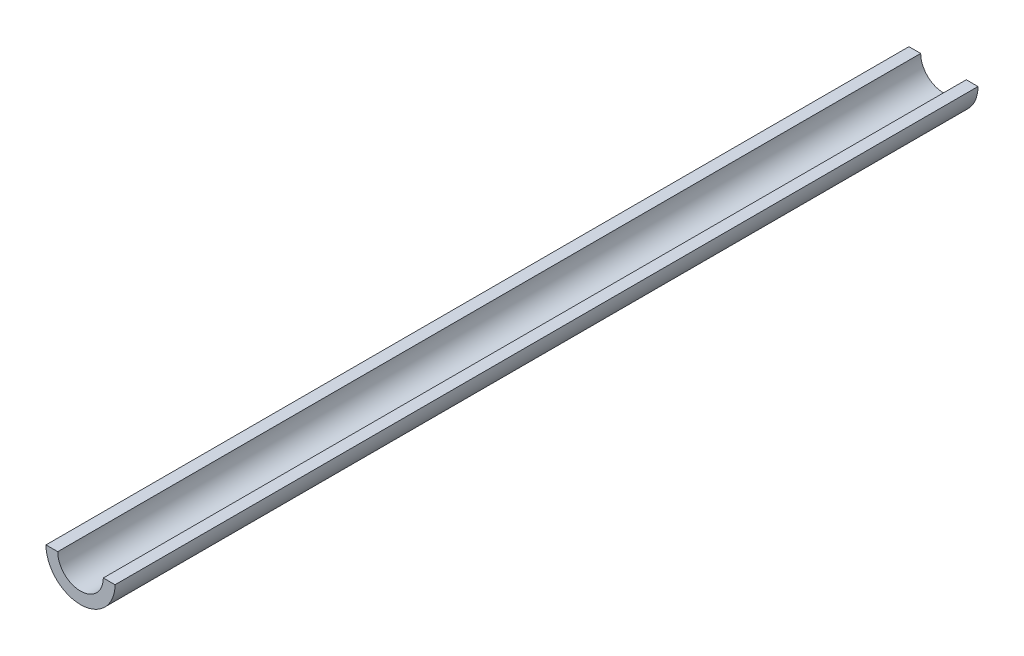
ISO-10303-21;
HEADER;
FILE_DESCRIPTION(('STEP AP214'),'2;1');
FILE_NAME('part.step','',(''),(''),'','','');
FILE_SCHEMA(('AUTOMOTIVE_DESIGN { 1 0 10303 214 1 1 1 1 }'));
ENDSEC;
DATA;
#1=APPLICATION_CONTEXT('core data for automotive mechanical design processes');
#2=APPLICATION_PROTOCOL_DEFINITION('international standard','automotive_design',2000,#1);
#3=PRODUCT_CONTEXT('',#1,'mechanical');
#4=PRODUCT('Part','Part','',(#3));
#5=PRODUCT_RELATED_PRODUCT_CATEGORY('part','',(#4));
#6=PRODUCT_DEFINITION_FORMATION('','',#4);
#7=PRODUCT_DEFINITION_CONTEXT('part definition',#1,'design');
#8=PRODUCT_DEFINITION('design','',#6,#7);
#9=PRODUCT_DEFINITION_SHAPE('','',#8);
#10=(LENGTH_UNIT() NAMED_UNIT(*) SI_UNIT(.MILLI.,.METRE.));
#11=(NAMED_UNIT(*) PLANE_ANGLE_UNIT() SI_UNIT($,.RADIAN.));
#12=(NAMED_UNIT(*) SI_UNIT($,.STERADIAN.) SOLID_ANGLE_UNIT());
#13=UNCERTAINTY_MEASURE_WITH_UNIT(LENGTH_MEASURE(1.E-05),#10,'distance_accuracy_value','');
#14=(GEOMETRIC_REPRESENTATION_CONTEXT(3) GLOBAL_UNCERTAINTY_ASSIGNED_CONTEXT((#13)) GLOBAL_UNIT_ASSIGNED_CONTEXT((#10,
#11,#12)) REPRESENTATION_CONTEXT('',''));
#15=CARTESIAN_POINT('',(0.,0.,0.));
#16=DIRECTION('',(0.,0.,1.));
#17=DIRECTION('',(1.,0.,0.));
#18=AXIS2_PLACEMENT_3D('',#15,#16,#17);
#19=CARTESIAN_POINT('',(0.,0.,250.));
#20=DIRECTION('',(0.,0.,-1.));
#21=DIRECTION('',(-1.,0.,0.));
#22=AXIS2_PLACEMENT_3D('',#19,#20,#21);
#23=CYLINDRICAL_SURFACE('',#22,6.60000000000002);
#24=CARTESIAN_POINT('',(0.,0.,0.));
#25=DIRECTION('',(0.,0.,-1.));
#26=DIRECTION('',(-1.,0.,0.));
#27=AXIS2_PLACEMENT_3D('',#24,#25,#26);
#28=CIRCLE('',#27,6.60000000000002);
#29=CARTESIAN_POINT('',(6.60000000000002,0.,0.));
#30=VERTEX_POINT('',#29);
#31=CARTESIAN_POINT('',(-6.60000000000002,0.,0.));
#32=VERTEX_POINT('',#31);
#33=EDGE_CURVE('E104',#30,#32,#28,.T.);
#34=ORIENTED_EDGE('',*,*,#33,.T.);
#35=DIRECTION('',(0.,0.,-1.));
#36=VECTOR('',#35,1.);
#37=CARTESIAN_POINT('',(-6.60000000000002,0.,250.));
#38=LINE('',#37,#36);
#39=CARTESIAN_POINT('',(-6.60000000000002,0.,250.));
#40=VERTEX_POINT('',#39);
#41=EDGE_CURVE('E11',#40,#32,#38,.T.);
#42=ORIENTED_EDGE('',*,*,#41,.F.);
#43=CARTESIAN_POINT('',(0.,0.,250.));
#44=DIRECTION('',(0.,0.,-1.));
#45=DIRECTION('',(-1.,0.,0.));
#46=AXIS2_PLACEMENT_3D('',#43,#44,#45);
#47=CIRCLE('',#46,6.60000000000002);
#48=CARTESIAN_POINT('',(6.60000000000002,0.,250.));
#49=VERTEX_POINT('',#48);
#50=EDGE_CURVE('E92',#49,#40,#47,.T.);
#51=ORIENTED_EDGE('',*,*,#50,.F.);
#52=DIRECTION('',(0.,0.,-1.));
#53=VECTOR('',#52,1.);
#54=CARTESIAN_POINT('',(6.60000000000002,0.,250.));
#55=LINE('',#54,#53);
#56=EDGE_CURVE('E100',#49,#30,#55,.T.);
#57=ORIENTED_EDGE('',*,*,#56,.T.);
#58=EDGE_LOOP('',(#34,#42,#51,#57));
#59=FACE_BOUND('',#58,.T.);
#60=ADVANCED_FACE('F41',(#59),#23,.F.);
#61=CARTESIAN_POINT('',(-10.,0.,250.));
#62=DIRECTION('',(0.,-1.,0.));
#63=DIRECTION('',(0.,0.,-1.));
#64=AXIS2_PLACEMENT_3D('',#61,#62,#63);
#65=PLANE('',#64);
#66=DIRECTION('',(-1.,0.,0.));
#67=VECTOR('',#66,1.);
#68=CARTESIAN_POINT('',(-10.,0.,0.));
#69=LINE('',#68,#67);
#70=CARTESIAN_POINT('',(-10.,0.,0.));
#71=VERTEX_POINT('',#70);
#72=EDGE_CURVE('E96',#32,#71,#69,.T.);
#73=ORIENTED_EDGE('',*,*,#72,.T.);
#74=DIRECTION('',(0.,0.,-1.));
#75=VECTOR('',#74,1.);
#76=CARTESIAN_POINT('',(-10.,0.,250.));
#77=LINE('',#76,#75);
#78=CARTESIAN_POINT('',(-10.,0.,250.));
#79=VERTEX_POINT('',#78);
#80=EDGE_CURVE('E49',#79,#71,#77,.T.);
#81=ORIENTED_EDGE('',*,*,#80,.F.);
#82=DIRECTION('',(-1.,0.,0.));
#83=VECTOR('',#82,1.);
#84=CARTESIAN_POINT('',(-10.,0.,250.));
#85=LINE('',#84,#83);
#86=EDGE_CURVE('E87',#40,#79,#85,.T.);
#87=ORIENTED_EDGE('',*,*,#86,.F.);
#88=ORIENTED_EDGE('',*,*,#41,.T.);
#89=EDGE_LOOP('',(#73,#81,#87,#88));
#90=FACE_BOUND('',#89,.T.);
#91=ADVANCED_FACE('F95',(#90),#65,.F.);
#92=CARTESIAN_POINT('',(0.,0.,250.));
#93=DIRECTION('',(0.,0.,-1.));
#94=DIRECTION('',(-1.,0.,0.));
#95=AXIS2_PLACEMENT_3D('',#92,#93,#94);
#96=CYLINDRICAL_SURFACE('',#95,10.);
#97=CARTESIAN_POINT('',(0.,0.,0.));
#98=DIRECTION('',(0.,0.,1.));
#99=DIRECTION('',(-1.,0.,0.));
#100=AXIS2_PLACEMENT_3D('',#97,#98,#99);
#101=CIRCLE('',#100,10.);
#102=CARTESIAN_POINT('',(10.,0.,0.));
#103=VERTEX_POINT('',#102);
#104=EDGE_CURVE('E74',#71,#103,#101,.T.);
#105=ORIENTED_EDGE('',*,*,#104,.T.);
#106=DIRECTION('',(0.,0.,-1.));
#107=VECTOR('',#106,1.);
#108=CARTESIAN_POINT('',(10.,0.,250.));
#109=LINE('',#108,#107);
#110=CARTESIAN_POINT('',(10.,0.,250.));
#111=VERTEX_POINT('',#110);
#112=EDGE_CURVE('E97',#111,#103,#109,.T.);
#113=ORIENTED_EDGE('',*,*,#112,.F.);
#114=CARTESIAN_POINT('',(0.,0.,250.));
#115=DIRECTION('',(0.,0.,1.));
#116=DIRECTION('',(-1.,0.,0.));
#117=AXIS2_PLACEMENT_3D('',#114,#115,#116);
#118=CIRCLE('',#117,10.);
#119=EDGE_CURVE('E90',#79,#111,#118,.T.);
#120=ORIENTED_EDGE('',*,*,#119,.F.);
#121=ORIENTED_EDGE('',*,*,#80,.T.);
#122=EDGE_LOOP('',(#105,#113,#120,#121));
#123=FACE_BOUND('',#122,.T.);
#124=ADVANCED_FACE('F98',(#123),#96,.T.);
#125=CARTESIAN_POINT('',(6.60000000000002,0.,250.));
#126=DIRECTION('',(0.,-1.,0.));
#127=DIRECTION('',(0.,0.,-1.));
#128=AXIS2_PLACEMENT_3D('',#125,#126,#127);
#129=PLANE('',#128);
#130=DIRECTION('',(-1.,0.,0.));
#131=VECTOR('',#130,1.);
#132=CARTESIAN_POINT('',(6.60000000000002,0.,0.));
#133=LINE('',#132,#131);
#134=EDGE_CURVE('E80',#103,#30,#133,.T.);
#135=ORIENTED_EDGE('',*,*,#134,.T.);
#136=ORIENTED_EDGE('',*,*,#56,.F.);
#137=DIRECTION('',(-1.,0.,0.));
#138=VECTOR('',#137,1.);
#139=CARTESIAN_POINT('',(6.60000000000002,0.,250.));
#140=LINE('',#139,#138);
#141=EDGE_CURVE('E57',#111,#49,#140,.T.);
#142=ORIENTED_EDGE('',*,*,#141,.F.);
#143=ORIENTED_EDGE('',*,*,#112,.T.);
#144=EDGE_LOOP('',(#135,#136,#142,#143));
#145=FACE_BOUND('',#144,.T.);
#146=ADVANCED_FACE('F111',(#145),#129,.F.);
#147=CARTESIAN_POINT('',(0.,0.,250.));
#148=DIRECTION('',(0.,0.,-1.));
#149=DIRECTION('',(-1.,0.,0.));
#150=AXIS2_PLACEMENT_3D('',#147,#148,#149);
#151=PLANE('',#150);
#152=ORIENTED_EDGE('',*,*,#50,.T.);
#153=ORIENTED_EDGE('',*,*,#86,.T.);
#154=ORIENTED_EDGE('',*,*,#119,.T.);
#155=ORIENTED_EDGE('',*,*,#141,.T.);
#156=EDGE_LOOP('',(#152,#153,#154,#155));
#157=FACE_BOUND('',#156,.T.);
#158=ADVANCED_FACE('F88',(#157),#151,.F.);
#159=CARTESIAN_POINT('',(0.,0.,0.));
#160=DIRECTION('',(0.,0.,-1.));
#161=DIRECTION('',(-1.,0.,0.));
#162=AXIS2_PLACEMENT_3D('',#159,#160,#161);
#163=PLANE('',#162);
#164=ORIENTED_EDGE('',*,*,#33,.F.);
#165=ORIENTED_EDGE('',*,*,#134,.F.);
#166=ORIENTED_EDGE('',*,*,#104,.F.);
#167=ORIENTED_EDGE('',*,*,#72,.F.);
#168=EDGE_LOOP('',(#164,#165,#166,#167));
#169=FACE_BOUND('',#168,.T.);
#170=ADVANCED_FACE('F114',(#169),#163,.T.);
#171=CLOSED_SHELL('',(#60,#91,#124,#146,#158,#170));
#172=MANIFOLD_SOLID_BREP('B2',#171);
#173=ADVANCED_BREP_SHAPE_REPRESENTATION('',(#18,#172),#14);
#174=SHAPE_DEFINITION_REPRESENTATION(#9,#173);
ENDSEC;
END-ISO-10303-21;
